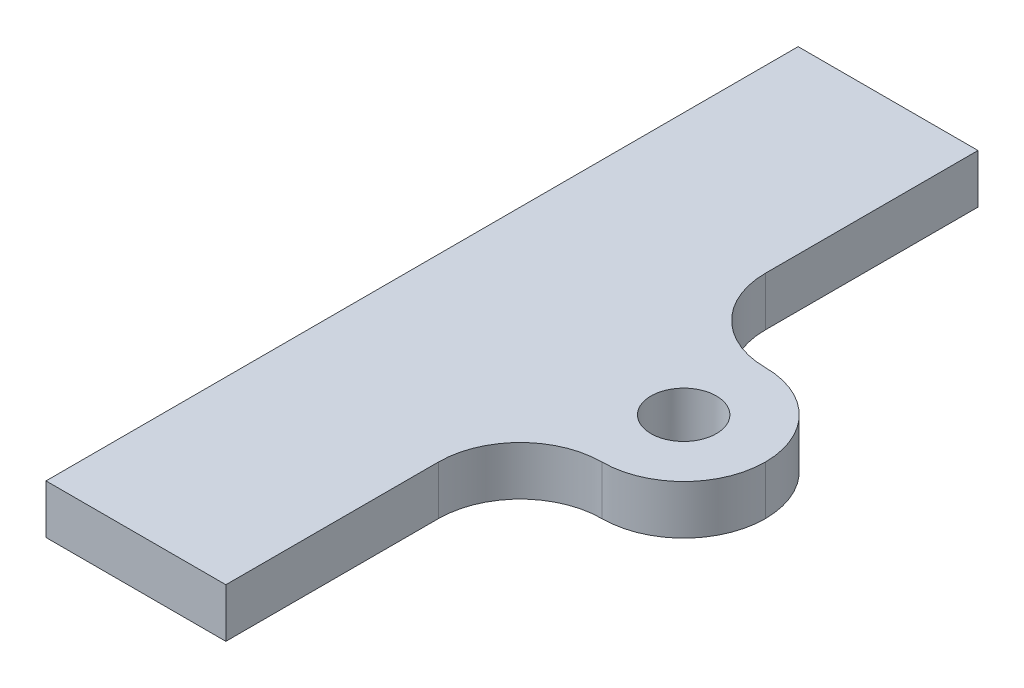
ISO-10303-21;
HEADER;
FILE_DESCRIPTION(('STEP AP214'),'2;1');
FILE_NAME('part.step','',(''),(''),'','','');
FILE_SCHEMA(('AUTOMOTIVE_DESIGN { 1 0 10303 214 1 1 1 1 }'));
ENDSEC;
DATA;
#1=APPLICATION_CONTEXT('core data for automotive mechanical design processes');
#2=APPLICATION_PROTOCOL_DEFINITION('international standard','automotive_design',2000,#1);
#3=PRODUCT_CONTEXT('',#1,'mechanical');
#4=PRODUCT('Part','Part','',(#3));
#5=PRODUCT_RELATED_PRODUCT_CATEGORY('part','',(#4));
#6=PRODUCT_DEFINITION_FORMATION('','',#4);
#7=PRODUCT_DEFINITION_CONTEXT('part definition',#1,'design');
#8=PRODUCT_DEFINITION('design','',#6,#7);
#9=PRODUCT_DEFINITION_SHAPE('','',#8);
#10=(LENGTH_UNIT() NAMED_UNIT(*) SI_UNIT(.MILLI.,.METRE.));
#11=(NAMED_UNIT(*) PLANE_ANGLE_UNIT() SI_UNIT($,.RADIAN.));
#12=(NAMED_UNIT(*) SI_UNIT($,.STERADIAN.) SOLID_ANGLE_UNIT());
#13=UNCERTAINTY_MEASURE_WITH_UNIT(LENGTH_MEASURE(1.E-05),#10,'distance_accuracy_value','');
#14=(GEOMETRIC_REPRESENTATION_CONTEXT(3) GLOBAL_UNCERTAINTY_ASSIGNED_CONTEXT((#13)) GLOBAL_UNIT_ASSIGNED_CONTEXT((#10,
#11,#12)) REPRESENTATION_CONTEXT('',''));
#15=CARTESIAN_POINT('',(0.,0.,0.));
#16=DIRECTION('',(0.,0.,1.));
#17=DIRECTION('',(1.,0.,0.));
#18=AXIS2_PLACEMENT_3D('',#15,#16,#17);
#19=CARTESIAN_POINT('',(6.5,0.,0.));
#20=DIRECTION('',(1.,0.,0.));
#21=DIRECTION('',(0.,0.,-1.));
#22=AXIS2_PLACEMENT_3D('',#19,#20,#21);
#23=PLANE('',#22);
#24=DIRECTION('',(0.,0.,1.));
#25=VECTOR('',#24,1.);
#26=CARTESIAN_POINT('',(6.5,3.,-23.));
#27=LINE('',#26,#25);
#28=CARTESIAN_POINT('',(6.5,3.,-23.));
#29=VERTEX_POINT('',#28);
#30=CARTESIAN_POINT('',(6.5,3.,-10.));
#31=VERTEX_POINT('',#30);
#32=EDGE_CURVE('E150',#29,#31,#27,.T.);
#33=ORIENTED_EDGE('',*,*,#32,.T.);
#34=DIRECTION('',(0.,1.,0.));
#35=VECTOR('',#34,1.);
#36=CARTESIAN_POINT('',(6.5,0.,-10.));
#37=LINE('',#36,#35);
#38=CARTESIAN_POINT('',(6.5,0.,-10.));
#39=VERTEX_POINT('',#38);
#40=EDGE_CURVE('E210',#31,#39,#37,.F.);
#41=ORIENTED_EDGE('',*,*,#40,.T.);
#42=DIRECTION('',(0.,0.,-1.));
#43=VECTOR('',#42,1.);
#44=CARTESIAN_POINT('',(6.5,0.,23.));
#45=LINE('',#44,#43);
#46=CARTESIAN_POINT('',(6.5,0.,-23.));
#47=VERTEX_POINT('',#46);
#48=EDGE_CURVE('E132',#39,#47,#45,.T.);
#49=ORIENTED_EDGE('',*,*,#48,.T.);
#50=DIRECTION('',(0.,1.,0.));
#51=VECTOR('',#50,1.);
#52=CARTESIAN_POINT('',(6.5,0.,-23.));
#53=LINE('',#52,#51);
#54=EDGE_CURVE('E131',#47,#29,#53,.T.);
#55=ORIENTED_EDGE('',*,*,#54,.T.);
#56=EDGE_LOOP('',(#33,#41,#49,#55));
#57=FACE_BOUND('',#56,.T.);
#58=ADVANCED_FACE('F44',(#57),#23,.T.);
#59=CARTESIAN_POINT('',(-4.5,3.,-23.));
#60=DIRECTION('',(0.,0.,1.));
#61=DIRECTION('',(1.,0.,0.));
#62=AXIS2_PLACEMENT_3D('',#59,#60,#61);
#63=PLANE('',#62);
#64=DIRECTION('',(-1.,0.,0.));
#65=VECTOR('',#64,1.);
#66=CARTESIAN_POINT('',(-4.5,0.,-23.));
#67=LINE('',#66,#65);
#68=CARTESIAN_POINT('',(-4.5,0.,-23.));
#69=VERTEX_POINT('',#68);
#70=EDGE_CURVE('E159',#47,#69,#67,.T.);
#71=ORIENTED_EDGE('',*,*,#70,.T.);
#72=DIRECTION('',(0.,-1.,0.));
#73=VECTOR('',#72,1.);
#74=CARTESIAN_POINT('',(-4.5,3.,-23.));
#75=LINE('',#74,#73);
#76=CARTESIAN_POINT('',(-4.5,3.,-23.));
#77=VERTEX_POINT('',#76);
#78=EDGE_CURVE('E177',#77,#69,#75,.T.);
#79=ORIENTED_EDGE('',*,*,#78,.F.);
#80=DIRECTION('',(-1.,0.,0.));
#81=VECTOR('',#80,1.);
#82=CARTESIAN_POINT('',(-4.5,3.,-23.));
#83=LINE('',#82,#81);
#84=EDGE_CURVE('E125',#29,#77,#83,.T.);
#85=ORIENTED_EDGE('',*,*,#84,.F.);
#86=ORIENTED_EDGE('',*,*,#54,.F.);
#87=EDGE_LOOP('',(#71,#79,#85,#86));
#88=FACE_BOUND('',#87,.T.);
#89=ADVANCED_FACE('F254',(#88),#63,.F.);
#90=CARTESIAN_POINT('',(-4.5,3.,23.));
#91=DIRECTION('',(1.,0.,0.));
#92=DIRECTION('',(0.,0.,-1.));
#93=AXIS2_PLACEMENT_3D('',#90,#91,#92);
#94=PLANE('',#93);
#95=DIRECTION('',(0.,0.,1.));
#96=VECTOR('',#95,1.);
#97=CARTESIAN_POINT('',(-4.5,0.,23.));
#98=LINE('',#97,#96);
#99=CARTESIAN_POINT('',(-4.5,0.,23.));
#100=VERTEX_POINT('',#99);
#101=EDGE_CURVE('E126',#69,#100,#98,.T.);
#102=ORIENTED_EDGE('',*,*,#101,.T.);
#103=DIRECTION('',(0.,-1.,0.));
#104=VECTOR('',#103,1.);
#105=CARTESIAN_POINT('',(-4.5,3.,23.));
#106=LINE('',#105,#104);
#107=CARTESIAN_POINT('',(-4.5,3.,23.));
#108=VERTEX_POINT('',#107);
#109=EDGE_CURVE('E122',#108,#100,#106,.T.);
#110=ORIENTED_EDGE('',*,*,#109,.F.);
#111=DIRECTION('',(0.,0.,1.));
#112=VECTOR('',#111,1.);
#113=CARTESIAN_POINT('',(-4.5,3.,23.));
#114=LINE('',#113,#112);
#115=EDGE_CURVE('E165',#77,#108,#114,.T.);
#116=ORIENTED_EDGE('',*,*,#115,.F.);
#117=ORIENTED_EDGE('',*,*,#78,.T.);
#118=EDGE_LOOP('',(#102,#110,#116,#117));
#119=FACE_BOUND('',#118,.T.);
#120=ADVANCED_FACE('F251',(#119),#94,.F.);
#121=CARTESIAN_POINT('',(-4.5,3.,23.));
#122=DIRECTION('',(0.,0.,-1.));
#123=DIRECTION('',(-1.,0.,0.));
#124=AXIS2_PLACEMENT_3D('',#121,#122,#123);
#125=PLANE('',#124);
#126=DIRECTION('',(1.,0.,0.));
#127=VECTOR('',#126,1.);
#128=CARTESIAN_POINT('',(-4.5,0.,23.));
#129=LINE('',#128,#127);
#130=CARTESIAN_POINT('',(6.5,0.,23.));
#131=VERTEX_POINT('',#130);
#132=EDGE_CURVE('E116',#100,#131,#129,.T.);
#133=ORIENTED_EDGE('',*,*,#132,.T.);
#134=DIRECTION('',(0.,-1.,0.));
#135=VECTOR('',#134,1.);
#136=CARTESIAN_POINT('',(6.5,3.,23.));
#137=LINE('',#136,#135);
#138=CARTESIAN_POINT('',(6.5,3.,23.));
#139=VERTEX_POINT('',#138);
#140=EDGE_CURVE('E120',#139,#131,#137,.T.);
#141=ORIENTED_EDGE('',*,*,#140,.F.);
#142=DIRECTION('',(1.,0.,0.));
#143=VECTOR('',#142,1.);
#144=CARTESIAN_POINT('',(-4.5,3.,23.));
#145=LINE('',#144,#143);
#146=EDGE_CURVE('E168',#108,#139,#145,.T.);
#147=ORIENTED_EDGE('',*,*,#146,.F.);
#148=ORIENTED_EDGE('',*,*,#109,.T.);
#149=EDGE_LOOP('',(#133,#141,#147,#148));
#150=FACE_BOUND('',#149,.T.);
#151=ADVANCED_FACE('F117',(#150),#125,.F.);
#152=CARTESIAN_POINT('',(0.,3.,0.));
#153=DIRECTION('',(0.,-1.,0.));
#154=DIRECTION('',(0.,0.,-1.));
#155=AXIS2_PLACEMENT_3D('',#152,#153,#154);
#156=PLANE('',#155);
#157=CARTESIAN_POINT('',(11.5,3.,0.));
#158=DIRECTION('',(0.,1.,0.));
#159=DIRECTION('',(0.,0.,1.));
#160=AXIS2_PLACEMENT_3D('',#157,#158,#159);
#161=CIRCLE('',#160,2.);
#162=CARTESIAN_POINT('',(11.5,3.,2.));
#163=VERTEX_POINT('',#162);
#164=EDGE_CURVE('E143',#163,#163,#161,.T.);
#165=ORIENTED_EDGE('',*,*,#164,.F.);
#166=EDGE_LOOP('',(#165));
#167=FACE_BOUND('',#166,.T.);
#168=CARTESIAN_POINT('',(6.5,3.,10.));
#169=VERTEX_POINT('',#168);
#170=EDGE_CURVE('E135',#169,#139,#27,.T.);
#171=ORIENTED_EDGE('',*,*,#170,.F.);
#172=CARTESIAN_POINT('',(11.5,3.,10.));
#173=DIRECTION('',(0.,-1.,0.));
#174=DIRECTION('',(0.,0.,-1.));
#175=AXIS2_PLACEMENT_3D('',#172,#173,#174);
#176=CIRCLE('',#175,5.);
#177=CARTESIAN_POINT('',(11.5,3.,5.));
#178=VERTEX_POINT('',#177);
#179=EDGE_CURVE('E11',#169,#178,#176,.T.);
#180=ORIENTED_EDGE('',*,*,#179,.T.);
#181=CARTESIAN_POINT('',(11.5,3.,0.));
#182=DIRECTION('',(0.,-1.,0.));
#183=DIRECTION('',(0.,0.,-1.));
#184=AXIS2_PLACEMENT_3D('',#181,#182,#183);
#185=CIRCLE('',#184,5.);
#186=CARTESIAN_POINT('',(16.5,3.,0.));
#187=VERTEX_POINT('',#186);
#188=EDGE_CURVE('E203',#178,#187,#185,.F.);
#189=ORIENTED_EDGE('',*,*,#188,.T.);
#190=CARTESIAN_POINT('',(11.5,3.,0.));
#191=DIRECTION('',(0.,-1.,0.));
#192=DIRECTION('',(0.,0.,-1.));
#193=AXIS2_PLACEMENT_3D('',#190,#191,#192);
#194=CIRCLE('',#193,5.);
#195=CARTESIAN_POINT('',(11.5,3.,-5.));
#196=VERTEX_POINT('',#195);
#197=EDGE_CURVE('E199',#187,#196,#194,.F.);
#198=ORIENTED_EDGE('',*,*,#197,.T.);
#199=CARTESIAN_POINT('',(11.5,3.,-10.));
#200=DIRECTION('',(0.,-1.,0.));
#201=DIRECTION('',(0.,0.,-1.));
#202=AXIS2_PLACEMENT_3D('',#199,#200,#201);
#203=CIRCLE('',#202,5.);
#204=EDGE_CURVE('E219',#196,#31,#203,.T.);
#205=ORIENTED_EDGE('',*,*,#204,.T.);
#206=ORIENTED_EDGE('',*,*,#32,.F.);
#207=ORIENTED_EDGE('',*,*,#84,.T.);
#208=ORIENTED_EDGE('',*,*,#115,.T.);
#209=ORIENTED_EDGE('',*,*,#146,.T.);
#210=EDGE_LOOP('',(#171,#180,#189,#198,#205,#206,#207,#208,#209));
#211=FACE_BOUND('',#210,.T.);
#212=ADVANCED_FACE('F241',(#167,#211),#156,.F.);
#213=CARTESIAN_POINT('',(0.,0.,0.));
#214=DIRECTION('',(0.,-1.,0.));
#215=DIRECTION('',(0.,0.,-1.));
#216=AXIS2_PLACEMENT_3D('',#213,#214,#215);
#217=PLANE('',#216);
#218=CARTESIAN_POINT('',(11.5,0.,0.));
#219=DIRECTION('',(0.,-1.,0.));
#220=DIRECTION('',(0.,0.,-1.));
#221=AXIS2_PLACEMENT_3D('',#218,#219,#220);
#222=CIRCLE('',#221,2.);
#223=CARTESIAN_POINT('',(11.5,0.,-2.));
#224=VERTEX_POINT('',#223);
#225=EDGE_CURVE('E138',#224,#224,#222,.T.);
#226=ORIENTED_EDGE('',*,*,#225,.F.);
#227=EDGE_LOOP('',(#226));
#228=FACE_BOUND('',#227,.T.);
#229=CARTESIAN_POINT('',(-1.7,0.,9.));
#230=DIRECTION('',(0.,-1.,0.));
#231=DIRECTION('',(0.,0.,-1.));
#232=AXIS2_PLACEMENT_3D('',#229,#230,#231);
#233=CIRCLE('',#232,1.25);
#234=CARTESIAN_POINT('',(-1.7,0.,7.75));
#235=VERTEX_POINT('',#234);
#236=EDGE_CURVE('E185',#235,#235,#233,.T.);
#237=ORIENTED_EDGE('',*,*,#236,.F.);
#238=EDGE_LOOP('',(#237));
#239=FACE_BOUND('',#238,.T.);
#240=CARTESIAN_POINT('',(-1.7,0.,-6.));
#241=DIRECTION('',(0.,-1.,0.));
#242=DIRECTION('',(0.,0.,-1.));
#243=AXIS2_PLACEMENT_3D('',#240,#241,#242);
#244=CIRCLE('',#243,1.25);
#245=CARTESIAN_POINT('',(-1.7,0.,-7.25));
#246=VERTEX_POINT('',#245);
#247=EDGE_CURVE('E181',#246,#246,#244,.T.);
#248=ORIENTED_EDGE('',*,*,#247,.F.);
#249=EDGE_LOOP('',(#248));
#250=FACE_BOUND('',#249,.T.);
#251=CARTESIAN_POINT('',(11.5,0.,0.));
#252=DIRECTION('',(0.,-1.,0.));
#253=DIRECTION('',(0.,0.,-1.));
#254=AXIS2_PLACEMENT_3D('',#251,#252,#253);
#255=CIRCLE('',#254,5.);
#256=CARTESIAN_POINT('',(11.5,0.,-5.));
#257=VERTEX_POINT('',#256);
#258=CARTESIAN_POINT('',(16.5,0.,0.));
#259=VERTEX_POINT('',#258);
#260=EDGE_CURVE('E188',#257,#259,#255,.T.);
#261=ORIENTED_EDGE('',*,*,#260,.T.);
#262=CARTESIAN_POINT('',(11.5,0.,0.));
#263=DIRECTION('',(0.,-1.,0.));
#264=DIRECTION('',(0.,0.,-1.));
#265=AXIS2_PLACEMENT_3D('',#262,#263,#264);
#266=CIRCLE('',#265,5.);
#267=CARTESIAN_POINT('',(11.5,0.,5.));
#268=VERTEX_POINT('',#267);
#269=EDGE_CURVE('E192',#259,#268,#266,.T.);
#270=ORIENTED_EDGE('',*,*,#269,.T.);
#271=CARTESIAN_POINT('',(11.5,0.,10.));
#272=DIRECTION('',(0.,-1.,0.));
#273=DIRECTION('',(0.,0.,-1.));
#274=AXIS2_PLACEMENT_3D('',#271,#272,#273);
#275=CIRCLE('',#274,5.);
#276=CARTESIAN_POINT('',(6.5,0.,10.));
#277=VERTEX_POINT('',#276);
#278=EDGE_CURVE('E53',#268,#277,#275,.F.);
#279=ORIENTED_EDGE('',*,*,#278,.T.);
#280=EDGE_CURVE('E128',#131,#277,#45,.T.);
#281=ORIENTED_EDGE('',*,*,#280,.F.);
#282=ORIENTED_EDGE('',*,*,#132,.F.);
#283=ORIENTED_EDGE('',*,*,#101,.F.);
#284=ORIENTED_EDGE('',*,*,#70,.F.);
#285=ORIENTED_EDGE('',*,*,#48,.F.);
#286=CARTESIAN_POINT('',(11.5,0.,-10.));
#287=DIRECTION('',(0.,-1.,0.));
#288=DIRECTION('',(0.,0.,-1.));
#289=AXIS2_PLACEMENT_3D('',#286,#287,#288);
#290=CIRCLE('',#289,5.);
#291=EDGE_CURVE('E222',#39,#257,#290,.F.);
#292=ORIENTED_EDGE('',*,*,#291,.T.);
#293=EDGE_LOOP('',(#261,#270,#279,#281,#282,#283,#284,#285,#292));
#294=FACE_BOUND('',#293,.T.);
#295=ADVANCED_FACE('F129',(#228,#239,#250,#294),#217,.T.);
#296=CARTESIAN_POINT('',(-1.7,-2.,-6.));
#297=DIRECTION('',(0.,1.,0.));
#298=DIRECTION('',(0.,0.,1.));
#299=AXIS2_PLACEMENT_3D('',#296,#297,#298);
#300=CYLINDRICAL_SURFACE('',#299,1.25);
#301=ORIENTED_EDGE('',*,*,#247,.T.);
#302=EDGE_LOOP('',(#301));
#303=FACE_BOUND('',#302,.T.);
#304=CARTESIAN_POINT('',(-1.7,-2.,-6.));
#305=DIRECTION('',(0.,1.,0.));
#306=DIRECTION('',(0.,0.,1.));
#307=AXIS2_PLACEMENT_3D('',#304,#305,#306);
#308=CIRCLE('',#307,1.25);
#309=CARTESIAN_POINT('',(-1.7,-2.,-4.75));
#310=VERTEX_POINT('',#309);
#311=EDGE_CURVE('E154',#310,#310,#308,.T.);
#312=ORIENTED_EDGE('',*,*,#311,.T.);
#313=EDGE_LOOP('',(#312));
#314=FACE_BOUND('',#313,.T.);
#315=ADVANCED_FACE('F285',(#303,#314),#300,.T.);
#316=CARTESIAN_POINT('',(-1.7,-2.,-6.));
#317=DIRECTION('',(0.,1.,0.));
#318=DIRECTION('',(0.,0.,1.));
#319=AXIS2_PLACEMENT_3D('',#316,#317,#318);
#320=PLANE('',#319);
#321=ORIENTED_EDGE('',*,*,#311,.F.);
#322=EDGE_LOOP('',(#321));
#323=FACE_BOUND('',#322,.T.);
#324=ADVANCED_FACE('F280',(#323),#320,.F.);
#325=CARTESIAN_POINT('',(-1.7,-2.,9.));
#326=DIRECTION('',(0.,1.,0.));
#327=DIRECTION('',(0.,0.,1.));
#328=AXIS2_PLACEMENT_3D('',#325,#326,#327);
#329=CYLINDRICAL_SURFACE('',#328,1.25);
#330=ORIENTED_EDGE('',*,*,#236,.T.);
#331=EDGE_LOOP('',(#330));
#332=FACE_BOUND('',#331,.T.);
#333=CARTESIAN_POINT('',(-1.7,-2.,9.));
#334=DIRECTION('',(0.,1.,0.));
#335=DIRECTION('',(0.,0.,1.));
#336=AXIS2_PLACEMENT_3D('',#333,#334,#335);
#337=CIRCLE('',#336,1.25);
#338=CARTESIAN_POINT('',(-1.7,-2.,10.25));
#339=VERTEX_POINT('',#338);
#340=EDGE_CURVE('E155',#339,#339,#337,.T.);
#341=ORIENTED_EDGE('',*,*,#340,.T.);
#342=EDGE_LOOP('',(#341));
#343=FACE_BOUND('',#342,.T.);
#344=ADVANCED_FACE('F275',(#332,#343),#329,.T.);
#345=CARTESIAN_POINT('',(-1.7,-2.,9.));
#346=DIRECTION('',(0.,1.,0.));
#347=DIRECTION('',(0.,0.,1.));
#348=AXIS2_PLACEMENT_3D('',#345,#346,#347);
#349=PLANE('',#348);
#350=ORIENTED_EDGE('',*,*,#340,.F.);
#351=EDGE_LOOP('',(#350));
#352=FACE_BOUND('',#351,.T.);
#353=ADVANCED_FACE('F268',(#352),#349,.F.);
#354=ORIENTED_EDGE('',*,*,#280,.T.);
#355=DIRECTION('',(0.,-1.,0.));
#356=VECTOR('',#355,1.);
#357=CARTESIAN_POINT('',(6.5,0.,10.));
#358=LINE('',#357,#356);
#359=EDGE_CURVE('E66',#277,#169,#358,.F.);
#360=ORIENTED_EDGE('',*,*,#359,.T.);
#361=ORIENTED_EDGE('',*,*,#170,.T.);
#362=ORIENTED_EDGE('',*,*,#140,.T.);
#363=EDGE_LOOP('',(#354,#360,#361,#362));
#364=FACE_BOUND('',#363,.T.);
#365=ADVANCED_FACE('F134',(#364),#23,.T.);
#366=CARTESIAN_POINT('',(11.5,-7.,0.));
#367=DIRECTION('',(0.,1.,0.));
#368=DIRECTION('',(0.,0.,1.));
#369=AXIS2_PLACEMENT_3D('',#366,#367,#368);
#370=CYLINDRICAL_SURFACE('',#369,2.);
#371=ORIENTED_EDGE('',*,*,#225,.T.);
#372=EDGE_LOOP('',(#371));
#373=FACE_BOUND('',#372,.T.);
#374=ORIENTED_EDGE('',*,*,#164,.T.);
#375=EDGE_LOOP('',(#374));
#376=FACE_BOUND('',#375,.T.);
#377=ADVANCED_FACE('F267',(#373,#376),#370,.F.);
#378=CARTESIAN_POINT('',(11.5,0.,0.));
#379=DIRECTION('',(0.,1.,0.));
#380=DIRECTION('',(0.,0.,1.));
#381=AXIS2_PLACEMENT_3D('',#378,#379,#380);
#382=CYLINDRICAL_SURFACE('',#381,5.);
#383=DIRECTION('',(0.,1.,0.));
#384=VECTOR('',#383,1.);
#385=CARTESIAN_POINT('',(11.5,0.,-5.));
#386=LINE('',#385,#384);
#387=EDGE_CURVE('E206',#196,#257,#386,.F.);
#388=ORIENTED_EDGE('',*,*,#387,.F.);
#389=ORIENTED_EDGE('',*,*,#197,.F.);
#390=DIRECTION('',(0.,1.,0.));
#391=VECTOR('',#390,1.);
#392=CARTESIAN_POINT('',(16.5,0.,0.));
#393=LINE('',#392,#391);
#394=EDGE_CURVE('E211',#259,#187,#393,.T.);
#395=ORIENTED_EDGE('',*,*,#394,.F.);
#396=ORIENTED_EDGE('',*,*,#260,.F.);
#397=EDGE_LOOP('',(#388,#389,#395,#396));
#398=FACE_BOUND('',#397,.T.);
#399=ADVANCED_FACE('F235',(#398),#382,.T.);
#400=CARTESIAN_POINT('',(11.5,0.,0.));
#401=DIRECTION('',(0.,-1.,0.));
#402=DIRECTION('',(0.,0.,-1.));
#403=AXIS2_PLACEMENT_3D('',#400,#401,#402);
#404=CYLINDRICAL_SURFACE('',#403,5.);
#405=ORIENTED_EDGE('',*,*,#188,.F.);
#406=DIRECTION('',(0.,-1.,0.));
#407=VECTOR('',#406,1.);
#408=CARTESIAN_POINT('',(11.5,0.,5.));
#409=LINE('',#408,#407);
#410=EDGE_CURVE('E195',#268,#178,#409,.F.);
#411=ORIENTED_EDGE('',*,*,#410,.F.);
#412=ORIENTED_EDGE('',*,*,#269,.F.);
#413=ORIENTED_EDGE('',*,*,#394,.T.);
#414=EDGE_LOOP('',(#405,#411,#412,#413));
#415=FACE_BOUND('',#414,.T.);
#416=ADVANCED_FACE('F244',(#415),#404,.T.);
#417=CARTESIAN_POINT('',(11.5,0.,-10.));
#418=DIRECTION('',(0.,1.,0.));
#419=DIRECTION('',(0.,0.,1.));
#420=AXIS2_PLACEMENT_3D('',#417,#418,#419);
#421=CYLINDRICAL_SURFACE('',#420,5.);
#422=ORIENTED_EDGE('',*,*,#291,.F.);
#423=ORIENTED_EDGE('',*,*,#40,.F.);
#424=ORIENTED_EDGE('',*,*,#204,.F.);
#425=ORIENTED_EDGE('',*,*,#387,.T.);
#426=EDGE_LOOP('',(#422,#423,#424,#425));
#427=FACE_BOUND('',#426,.T.);
#428=ADVANCED_FACE('F238',(#427),#421,.F.);
#429=CARTESIAN_POINT('',(11.5,0.,10.));
#430=DIRECTION('',(0.,-1.,0.));
#431=DIRECTION('',(0.,0.,-1.));
#432=AXIS2_PLACEMENT_3D('',#429,#430,#431);
#433=CYLINDRICAL_SURFACE('',#432,5.);
#434=ORIENTED_EDGE('',*,*,#179,.F.);
#435=ORIENTED_EDGE('',*,*,#359,.F.);
#436=ORIENTED_EDGE('',*,*,#278,.F.);
#437=ORIENTED_EDGE('',*,*,#410,.T.);
#438=EDGE_LOOP('',(#434,#435,#436,#437));
#439=FACE_BOUND('',#438,.T.);
#440=ADVANCED_FACE('F46',(#439),#433,.F.);
#441=CLOSED_SHELL('',(#58,#89,#120,#151,#212,#295,#315,#324,#344,#353,#365,#377,#399,#416,#428,#440));
#442=MANIFOLD_SOLID_BREP('B2',#441);
#443=ADVANCED_BREP_SHAPE_REPRESENTATION('',(#18,#442),#14);
#444=SHAPE_DEFINITION_REPRESENTATION(#9,#443);
ENDSEC;
END-ISO-10303-21;
